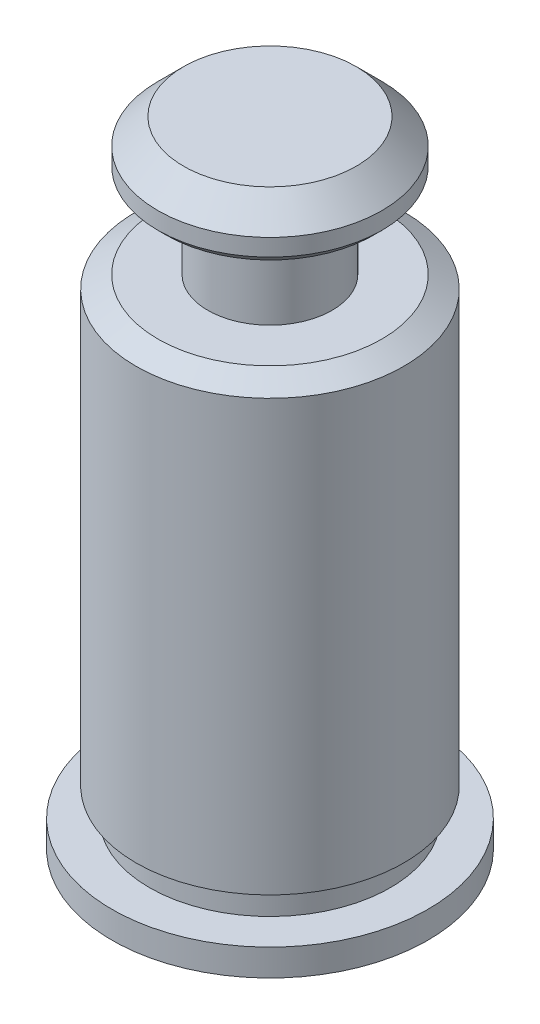
ISO-10303-21;
HEADER;
FILE_DESCRIPTION(('STEP AP214'),'2;1');
FILE_NAME('part.step','',(''),(''),'','','');
FILE_SCHEMA(('AUTOMOTIVE_DESIGN { 1 0 10303 214 1 1 1 1 }'));
ENDSEC;
DATA;
#1=APPLICATION_CONTEXT('core data for automotive mechanical design processes');
#2=APPLICATION_PROTOCOL_DEFINITION('international standard','automotive_design',2000,#1);
#3=PRODUCT_CONTEXT('',#1,'mechanical');
#4=PRODUCT('Part','Part','',(#3));
#5=PRODUCT_RELATED_PRODUCT_CATEGORY('part','',(#4));
#6=PRODUCT_DEFINITION_FORMATION('','',#4);
#7=PRODUCT_DEFINITION_CONTEXT('part definition',#1,'design');
#8=PRODUCT_DEFINITION('design','',#6,#7);
#9=PRODUCT_DEFINITION_SHAPE('','',#8);
#10=(LENGTH_UNIT() NAMED_UNIT(*) SI_UNIT(.MILLI.,.METRE.));
#11=(NAMED_UNIT(*) PLANE_ANGLE_UNIT() SI_UNIT($,.RADIAN.));
#12=(NAMED_UNIT(*) SI_UNIT($,.STERADIAN.) SOLID_ANGLE_UNIT());
#13=UNCERTAINTY_MEASURE_WITH_UNIT(LENGTH_MEASURE(1.E-05),#10,'distance_accuracy_value','');
#14=(GEOMETRIC_REPRESENTATION_CONTEXT(3) GLOBAL_UNCERTAINTY_ASSIGNED_CONTEXT((#13)) GLOBAL_UNIT_ASSIGNED_CONTEXT((#10,
#11,#12)) REPRESENTATION_CONTEXT('',''));
#15=CARTESIAN_POINT('',(0.,0.,0.));
#16=DIRECTION('',(0.,0.,1.));
#17=DIRECTION('',(1.,0.,0.));
#18=AXIS2_PLACEMENT_3D('',#15,#16,#17);
#19=CARTESIAN_POINT('',(0.,0.00507999999999704,0.));
#20=DIRECTION('',(0.,-1.,0.));
#21=DIRECTION('',(0.,0.,-1.));
#22=AXIS2_PLACEMENT_3D('',#19,#20,#21);
#23=PLANE('',#22);
#24=CARTESIAN_POINT('',(0.,0.00507999999999672,0.));
#25=DIRECTION('',(0.,-1.,0.));
#26=DIRECTION('',(0.,0.,-1.));
#27=AXIS2_PLACEMENT_3D('',#24,#25,#26);
#28=CIRCLE('',#27,2.69);
#29=CARTESIAN_POINT('',(0.,0.00507999999999672,-2.69));
#30=VERTEX_POINT('',#29);
#31=EDGE_CURVE('E79',#30,#30,#28,.T.);
#32=ORIENTED_EDGE('',*,*,#31,.T.);
#33=EDGE_LOOP('',(#32));
#34=FACE_BOUND('',#33,.T.);
#35=ADVANCED_FACE('F30',(#34),#23,.T.);
#36=CARTESIAN_POINT('',(1.735,12.75,0.));
#37=DIRECTION('',(0.,1.,0.));
#38=DIRECTION('',(0.,0.,1.));
#39=AXIS2_PLACEMENT_3D('',#36,#37,#38);
#40=PLANE('',#39);
#41=CARTESIAN_POINT('',(0.,12.75,0.));
#42=DIRECTION('',(0.,-1.,0.));
#43=DIRECTION('',(0.,0.,-1.));
#44=AXIS2_PLACEMENT_3D('',#41,#42,#43);
#45=CIRCLE('',#44,1.735);
#46=CARTESIAN_POINT('',(0.,12.75,-1.735));
#47=VERTEX_POINT('',#46);
#48=EDGE_CURVE('E10',#47,#47,#45,.T.);
#49=ORIENTED_EDGE('',*,*,#48,.F.);
#50=EDGE_LOOP('',(#49));
#51=FACE_BOUND('',#50,.T.);
#52=ADVANCED_FACE('F96',(#51),#40,.T.);
#53=CARTESIAN_POINT('',(0.,12.235,0.));
#54=DIRECTION('',(0.,-1.,0.));
#55=DIRECTION('',(0.,0.,-1.));
#56=AXIS2_PLACEMENT_3D('',#53,#54,#55);
#57=CONICAL_SURFACE('',#56,2.25,0.785398163397447);
#58=ORIENTED_EDGE('',*,*,#48,.T.);
#59=EDGE_LOOP('',(#58));
#60=FACE_BOUND('',#59,.T.);
#61=CARTESIAN_POINT('',(0.,12.235,0.));
#62=DIRECTION('',(0.,-1.,0.));
#63=DIRECTION('',(0.,0.,-1.));
#64=AXIS2_PLACEMENT_3D('',#61,#62,#63);
#65=CIRCLE('',#64,2.25);
#66=CARTESIAN_POINT('',(0.,12.235,-2.25));
#67=VERTEX_POINT('',#66);
#68=EDGE_CURVE('E36',#67,#67,#65,.T.);
#69=ORIENTED_EDGE('',*,*,#68,.F.);
#70=EDGE_LOOP('',(#69));
#71=FACE_BOUND('',#70,.T.);
#72=ADVANCED_FACE('F100',(#60,#71),#57,.T.);
#73=CARTESIAN_POINT('',(0.,0.,0.));
#74=DIRECTION('',(0.,-1.,0.));
#75=DIRECTION('',(0.,0.,-1.));
#76=AXIS2_PLACEMENT_3D('',#73,#74,#75);
#77=CYLINDRICAL_SURFACE('',#76,2.25);
#78=ORIENTED_EDGE('',*,*,#68,.T.);
#79=EDGE_LOOP('',(#78));
#80=FACE_BOUND('',#79,.T.);
#81=CARTESIAN_POINT('',(0.,11.8916666666667,0.));
#82=DIRECTION('',(0.,-1.,0.));
#83=DIRECTION('',(0.,0.,-1.));
#84=AXIS2_PLACEMENT_3D('',#81,#82,#83);
#85=CIRCLE('',#84,2.25);
#86=CARTESIAN_POINT('',(0.,11.8916666666667,-2.25));
#87=VERTEX_POINT('',#86);
#88=EDGE_CURVE('E40',#87,#87,#85,.T.);
#89=ORIENTED_EDGE('',*,*,#88,.F.);
#90=EDGE_LOOP('',(#89));
#91=FACE_BOUND('',#90,.T.);
#92=ADVANCED_FACE('F105',(#80,#91),#77,.T.);
#93=CARTESIAN_POINT('',(0.,11.72,0.));
#94=DIRECTION('',(0.,1.,0.));
#95=DIRECTION('',(0.,0.,1.));
#96=AXIS2_PLACEMENT_3D('',#93,#94,#95);
#97=CONICAL_SURFACE('',#96,2.07833333333333,0.785398163397452);
#98=ORIENTED_EDGE('',*,*,#88,.T.);
#99=EDGE_LOOP('',(#98));
#100=FACE_BOUND('',#99,.T.);
#101=CARTESIAN_POINT('',(0.,11.72,0.));
#102=DIRECTION('',(0.,-1.,0.));
#103=DIRECTION('',(0.,0.,-1.));
#104=AXIS2_PLACEMENT_3D('',#101,#102,#103);
#105=CIRCLE('',#104,2.07833333333333);
#106=CARTESIAN_POINT('',(0.,11.72,-2.07833333333333));
#107=VERTEX_POINT('',#106);
#108=EDGE_CURVE('E44',#107,#107,#105,.T.);
#109=ORIENTED_EDGE('',*,*,#108,.F.);
#110=EDGE_LOOP('',(#109));
#111=FACE_BOUND('',#110,.T.);
#112=ADVANCED_FACE('F110',(#100,#111),#97,.T.);
#113=CARTESIAN_POINT('',(1.25,11.72,0.));
#114=DIRECTION('',(0.,-1.,0.));
#115=DIRECTION('',(0.,0.,-1.));
#116=AXIS2_PLACEMENT_3D('',#113,#114,#115);
#117=PLANE('',#116);
#118=ORIENTED_EDGE('',*,*,#108,.T.);
#119=EDGE_LOOP('',(#118));
#120=FACE_BOUND('',#119,.T.);
#121=CARTESIAN_POINT('',(0.,11.72,0.));
#122=DIRECTION('',(0.,-1.,0.));
#123=DIRECTION('',(0.,0.,-1.));
#124=AXIS2_PLACEMENT_3D('',#121,#122,#123);
#125=CIRCLE('',#124,1.25);
#126=CARTESIAN_POINT('',(0.,11.72,-1.25));
#127=VERTEX_POINT('',#126);
#128=EDGE_CURVE('E49',#127,#127,#125,.T.);
#129=ORIENTED_EDGE('',*,*,#128,.F.);
#130=EDGE_LOOP('',(#129));
#131=FACE_BOUND('',#130,.T.);
#132=ADVANCED_FACE('F113',(#120,#131),#117,.T.);
#133=CARTESIAN_POINT('',(0.,0.,0.));
#134=DIRECTION('',(0.,-1.,0.));
#135=DIRECTION('',(0.,0.,-1.));
#136=AXIS2_PLACEMENT_3D('',#133,#134,#135);
#137=CYLINDRICAL_SURFACE('',#136,1.25);
#138=ORIENTED_EDGE('',*,*,#128,.T.);
#139=EDGE_LOOP('',(#138));
#140=FACE_BOUND('',#139,.T.);
#141=CARTESIAN_POINT('',(0.,10.,0.));
#142=DIRECTION('',(0.,-1.,0.));
#143=DIRECTION('',(0.,0.,-1.));
#144=AXIS2_PLACEMENT_3D('',#141,#142,#143);
#145=CIRCLE('',#144,1.25);
#146=CARTESIAN_POINT('',(0.,10.,-1.25));
#147=VERTEX_POINT('',#146);
#148=EDGE_CURVE('E52',#147,#147,#145,.T.);
#149=ORIENTED_EDGE('',*,*,#148,.F.);
#150=EDGE_LOOP('',(#149));
#151=FACE_BOUND('',#150,.T.);
#152=ADVANCED_FACE('F117',(#140,#151),#137,.T.);
#153=CARTESIAN_POINT('',(2.25,10.,0.));
#154=DIRECTION('',(0.,1.,0.));
#155=DIRECTION('',(0.,0.,1.));
#156=AXIS2_PLACEMENT_3D('',#153,#154,#155);
#157=PLANE('',#156);
#158=ORIENTED_EDGE('',*,*,#148,.T.);
#159=EDGE_LOOP('',(#158));
#160=FACE_BOUND('',#159,.T.);
#161=CARTESIAN_POINT('',(0.,10.,0.));
#162=DIRECTION('',(0.,-1.,0.));
#163=DIRECTION('',(0.,0.,-1.));
#164=AXIS2_PLACEMENT_3D('',#161,#162,#163);
#165=CIRCLE('',#164,2.25);
#166=CARTESIAN_POINT('',(0.,10.,-2.25));
#167=VERTEX_POINT('',#166);
#168=EDGE_CURVE('E55',#167,#167,#165,.T.);
#169=ORIENTED_EDGE('',*,*,#168,.F.);
#170=EDGE_LOOP('',(#169));
#171=FACE_BOUND('',#170,.T.);
#172=ADVANCED_FACE('F121',(#160,#171),#157,.T.);
#173=CARTESIAN_POINT('',(0.,9.74596588155657,0.));
#174=DIRECTION('',(0.,-1.,0.));
#175=DIRECTION('',(0.,0.,-1.));
#176=AXIS2_PLACEMENT_3D('',#173,#174,#175);
#177=CONICAL_SURFACE('',#176,2.69,1.0471975511966);
#178=ORIENTED_EDGE('',*,*,#168,.T.);
#179=EDGE_LOOP('',(#178));
#180=FACE_BOUND('',#179,.T.);
#181=CARTESIAN_POINT('',(0.,9.74596588155657,0.));
#182=DIRECTION('',(0.,-1.,0.));
#183=DIRECTION('',(0.,0.,-1.));
#184=AXIS2_PLACEMENT_3D('',#181,#182,#183);
#185=CIRCLE('',#184,2.69);
#186=CARTESIAN_POINT('',(0.,9.74596588155657,-2.69));
#187=VERTEX_POINT('',#186);
#188=EDGE_CURVE('E58',#187,#187,#185,.T.);
#189=ORIENTED_EDGE('',*,*,#188,.F.);
#190=EDGE_LOOP('',(#189));
#191=FACE_BOUND('',#190,.T.);
#192=ADVANCED_FACE('F125',(#180,#191),#177,.T.);
#193=CARTESIAN_POINT('',(0.,0.,0.));
#194=DIRECTION('',(0.,-1.,0.));
#195=DIRECTION('',(0.,0.,-1.));
#196=AXIS2_PLACEMENT_3D('',#193,#194,#195);
#197=CYLINDRICAL_SURFACE('',#196,2.69);
#198=ORIENTED_EDGE('',*,*,#188,.T.);
#199=EDGE_LOOP('',(#198));
#200=FACE_BOUND('',#199,.T.);
#201=CARTESIAN_POINT('',(0.,1.1029,0.));
#202=DIRECTION('',(0.,-1.,0.));
#203=DIRECTION('',(0.,0.,-1.));
#204=AXIS2_PLACEMENT_3D('',#201,#202,#203);
#205=CIRCLE('',#204,2.69);
#206=CARTESIAN_POINT('',(0.,1.1029,-2.69));
#207=VERTEX_POINT('',#206);
#208=EDGE_CURVE('E61',#207,#207,#205,.T.);
#209=ORIENTED_EDGE('',*,*,#208,.F.);
#210=EDGE_LOOP('',(#209));
#211=FACE_BOUND('',#210,.T.);
#212=ADVANCED_FACE('F129',(#200,#211),#197,.T.);
#213=CARTESIAN_POINT('',(2.69,1.1029,0.));
#214=DIRECTION('',(0.,-1.,0.));
#215=DIRECTION('',(0.,0.,-1.));
#216=AXIS2_PLACEMENT_3D('',#213,#214,#215);
#217=PLANE('',#216);
#218=ORIENTED_EDGE('',*,*,#208,.T.);
#219=EDGE_LOOP('',(#218));
#220=FACE_BOUND('',#219,.T.);
#221=CARTESIAN_POINT('',(0.,1.1029,0.));
#222=DIRECTION('',(0.,-1.,0.));
#223=DIRECTION('',(0.,0.,-1.));
#224=AXIS2_PLACEMENT_3D('',#221,#222,#223);
#225=CIRCLE('',#224,2.421);
#226=CARTESIAN_POINT('',(0.,1.1029,-2.421));
#227=VERTEX_POINT('',#226);
#228=EDGE_CURVE('E64',#227,#227,#225,.T.);
#229=ORIENTED_EDGE('',*,*,#228,.F.);
#230=EDGE_LOOP('',(#229));
#231=FACE_BOUND('',#230,.T.);
#232=ADVANCED_FACE('F133',(#220,#231),#217,.T.);
#233=CARTESIAN_POINT('',(0.,0.,0.));
#234=DIRECTION('',(0.,-1.,0.));
#235=DIRECTION('',(0.,0.,-1.));
#236=AXIS2_PLACEMENT_3D('',#233,#234,#235);
#237=CYLINDRICAL_SURFACE('',#236,2.421);
#238=ORIENTED_EDGE('',*,*,#228,.T.);
#239=EDGE_LOOP('',(#238));
#240=FACE_BOUND('',#239,.T.);
#241=CARTESIAN_POINT('',(0.,0.538,0.));
#242=DIRECTION('',(0.,-1.,0.));
#243=DIRECTION('',(0.,0.,-1.));
#244=AXIS2_PLACEMENT_3D('',#241,#242,#243);
#245=CIRCLE('',#244,2.421);
#246=CARTESIAN_POINT('',(0.,0.538,-2.421));
#247=VERTEX_POINT('',#246);
#248=EDGE_CURVE('E67',#247,#247,#245,.T.);
#249=ORIENTED_EDGE('',*,*,#248,.F.);
#250=EDGE_LOOP('',(#249));
#251=FACE_BOUND('',#250,.T.);
#252=ADVANCED_FACE('F137',(#240,#251),#237,.T.);
#253=CARTESIAN_POINT('',(3.175,0.538,0.));
#254=DIRECTION('',(0.,1.,0.));
#255=DIRECTION('',(0.,0.,1.));
#256=AXIS2_PLACEMENT_3D('',#253,#254,#255);
#257=PLANE('',#256);
#258=ORIENTED_EDGE('',*,*,#248,.T.);
#259=EDGE_LOOP('',(#258));
#260=FACE_BOUND('',#259,.T.);
#261=CARTESIAN_POINT('',(0.,0.538,0.));
#262=DIRECTION('',(0.,-1.,0.));
#263=DIRECTION('',(0.,0.,-1.));
#264=AXIS2_PLACEMENT_3D('',#261,#262,#263);
#265=CIRCLE('',#264,3.175);
#266=CARTESIAN_POINT('',(0.,0.538,-3.175));
#267=VERTEX_POINT('',#266);
#268=EDGE_CURVE('E70',#267,#267,#265,.T.);
#269=ORIENTED_EDGE('',*,*,#268,.F.);
#270=EDGE_LOOP('',(#269));
#271=FACE_BOUND('',#270,.T.);
#272=ADVANCED_FACE('F141',(#260,#271),#257,.T.);
#273=CARTESIAN_POINT('',(0.,0.,0.));
#274=DIRECTION('',(0.,-1.,0.));
#275=DIRECTION('',(0.,0.,-1.));
#276=AXIS2_PLACEMENT_3D('',#273,#274,#275);
#277=CYLINDRICAL_SURFACE('',#276,3.175);
#278=ORIENTED_EDGE('',*,*,#268,.T.);
#279=EDGE_LOOP('',(#278));
#280=FACE_BOUND('',#279,.T.);
#281=CARTESIAN_POINT('',(0.,0.,0.));
#282=DIRECTION('',(0.,-1.,0.));
#283=DIRECTION('',(0.,0.,-1.));
#284=AXIS2_PLACEMENT_3D('',#281,#282,#283);
#285=CIRCLE('',#284,3.175);
#286=CARTESIAN_POINT('',(0.,0.,-3.175));
#287=VERTEX_POINT('',#286);
#288=EDGE_CURVE('E73',#287,#287,#285,.T.);
#289=ORIENTED_EDGE('',*,*,#288,.F.);
#290=EDGE_LOOP('',(#289));
#291=FACE_BOUND('',#290,.T.);
#292=ADVANCED_FACE('F92',(#280,#291),#277,.T.);
#293=CARTESIAN_POINT('',(2.69,0.,0.));
#294=DIRECTION('',(0.,-1.,0.));
#295=DIRECTION('',(0.,0.,-1.));
#296=AXIS2_PLACEMENT_3D('',#293,#294,#295);
#297=PLANE('',#296);
#298=ORIENTED_EDGE('',*,*,#288,.T.);
#299=EDGE_LOOP('',(#298));
#300=FACE_BOUND('',#299,.T.);
#301=CARTESIAN_POINT('',(0.,0.,0.));
#302=DIRECTION('',(0.,-1.,0.));
#303=DIRECTION('',(0.,0.,-1.));
#304=AXIS2_PLACEMENT_3D('',#301,#302,#303);
#305=CIRCLE('',#304,2.69);
#306=CARTESIAN_POINT('',(0.,0.,-2.69));
#307=VERTEX_POINT('',#306);
#308=EDGE_CURVE('E76',#307,#307,#305,.T.);
#309=ORIENTED_EDGE('',*,*,#308,.F.);
#310=EDGE_LOOP('',(#309));
#311=FACE_BOUND('',#310,.T.);
#312=ADVANCED_FACE('F86',(#300,#311),#297,.T.);
#313=CARTESIAN_POINT('',(0.,0.,0.));
#314=DIRECTION('',(0.,-1.,0.));
#315=DIRECTION('',(0.,0.,-1.));
#316=AXIS2_PLACEMENT_3D('',#313,#314,#315);
#317=CYLINDRICAL_SURFACE('',#316,2.69);
#318=ORIENTED_EDGE('',*,*,#308,.T.);
#319=EDGE_LOOP('',(#318));
#320=FACE_BOUND('',#319,.T.);
#321=ORIENTED_EDGE('',*,*,#31,.F.);
#322=EDGE_LOOP('',(#321));
#323=FACE_BOUND('',#322,.T.);
#324=ADVANCED_FACE('F84',(#320,#323),#317,.F.);
#325=CLOSED_SHELL('',(#35,#52,#72,#92,#112,#132,#152,#172,#192,#212,#232,#252,#272,#292,#312,#324));
#326=MANIFOLD_SOLID_BREP('B2',#325);
#327=ADVANCED_BREP_SHAPE_REPRESENTATION('',(#18,#326),#14);
#328=SHAPE_DEFINITION_REPRESENTATION(#9,#327);
ENDSEC;
END-ISO-10303-21;
